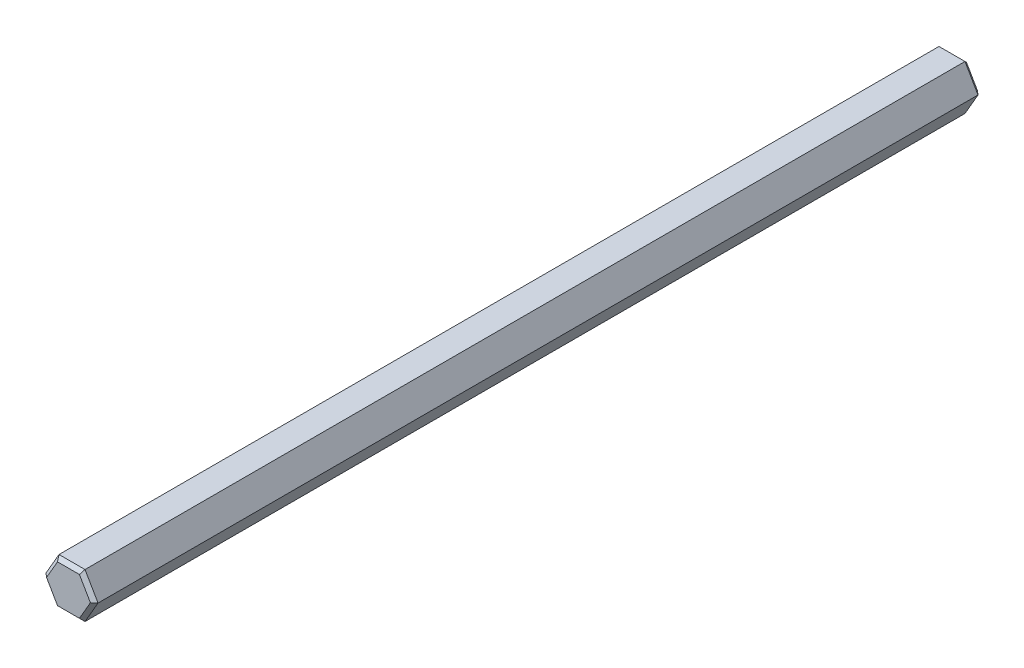
ISO-10303-21;
HEADER;
FILE_DESCRIPTION(('STEP AP214'),'2;1');
FILE_NAME('part.step','',(''),(''),'','','');
FILE_SCHEMA(('AUTOMOTIVE_DESIGN { 1 0 10303 214 1 1 1 1 }'));
ENDSEC;
DATA;
#1=APPLICATION_CONTEXT('core data for automotive mechanical design processes');
#2=APPLICATION_PROTOCOL_DEFINITION('international standard','automotive_design',2000,#1);
#3=PRODUCT_CONTEXT('',#1,'mechanical');
#4=PRODUCT('Part','Part','',(#3));
#5=PRODUCT_RELATED_PRODUCT_CATEGORY('part','',(#4));
#6=PRODUCT_DEFINITION_FORMATION('','',#4);
#7=PRODUCT_DEFINITION_CONTEXT('part definition',#1,'design');
#8=PRODUCT_DEFINITION('design','',#6,#7);
#9=PRODUCT_DEFINITION_SHAPE('','',#8);
#10=(LENGTH_UNIT() NAMED_UNIT(*) SI_UNIT(.MILLI.,.METRE.));
#11=(NAMED_UNIT(*) PLANE_ANGLE_UNIT() SI_UNIT($,.RADIAN.));
#12=(NAMED_UNIT(*) SI_UNIT($,.STERADIAN.) SOLID_ANGLE_UNIT());
#13=UNCERTAINTY_MEASURE_WITH_UNIT(LENGTH_MEASURE(1.E-05),#10,'distance_accuracy_value','');
#14=(GEOMETRIC_REPRESENTATION_CONTEXT(3) GLOBAL_UNCERTAINTY_ASSIGNED_CONTEXT((#13)) GLOBAL_UNIT_ASSIGNED_CONTEXT((#10,
#11,#12)) REPRESENTATION_CONTEXT('',''));
#15=CARTESIAN_POINT('',(0.,0.,0.));
#16=DIRECTION('',(0.,0.,1.));
#17=DIRECTION('',(1.,0.,0.));
#18=AXIS2_PLACEMENT_3D('',#15,#16,#17);
#19=CARTESIAN_POINT('',(1.8330871046771,-3.17499999999998,62.5));
#20=DIRECTION('',(-0.866025403784441,0.499999999999995,0.));
#21=DIRECTION('',(-0.499999999999995,-0.866025403784441,0.));
#22=AXIS2_PLACEMENT_3D('',#19,#20,#21);
#23=PLANE('',#22);
#24=DIRECTION('',(0.,0.,-1.));
#25=VECTOR('',#24,1.);
#26=CARTESIAN_POINT('',(1.8330871046771,-3.17499999999998,62.5));
#27=LINE('',#26,#25);
#28=CARTESIAN_POINT('',(1.8330871046771,-3.17499999999998,62.));
#29=VERTEX_POINT('',#28);
#30=CARTESIAN_POINT('',(1.8330871046771,-3.17499999999998,-62.));
#31=VERTEX_POINT('',#30);
#32=EDGE_CURVE('E222',#29,#31,#27,.T.);
#33=ORIENTED_EDGE('',*,*,#32,.T.);
#34=DIRECTION('',(0.499999999999995,0.866025403784441,0.));
#35=VECTOR('',#34,1.);
#36=CARTESIAN_POINT('',(1.8330871046771,-3.17499999999998,-62.));
#37=LINE('',#36,#35);
#38=CARTESIAN_POINT('',(3.66617420935413,0.,-62.));
#39=VERTEX_POINT('',#38);
#40=EDGE_CURVE('E197',#31,#39,#37,.T.);
#41=ORIENTED_EDGE('',*,*,#40,.T.);
#42=DIRECTION('',(0.,0.,-1.));
#43=VECTOR('',#42,1.);
#44=CARTESIAN_POINT('',(3.66617420935413,0.,62.5));
#45=LINE('',#44,#43);
#46=CARTESIAN_POINT('',(3.66617420935413,0.,62.));
#47=VERTEX_POINT('',#46);
#48=EDGE_CURVE('E151',#47,#39,#45,.T.);
#49=ORIENTED_EDGE('',*,*,#48,.F.);
#50=DIRECTION('',(-0.499999999999995,-0.866025403784441,0.));
#51=VECTOR('',#50,1.);
#52=CARTESIAN_POINT('',(1.8330871046771,-3.17499999999998,62.));
#53=LINE('',#52,#51);
#54=EDGE_CURVE('E195',#47,#29,#53,.T.);
#55=ORIENTED_EDGE('',*,*,#54,.T.);
#56=EDGE_LOOP('',(#33,#41,#49,#55));
#57=FACE_BOUND('',#56,.T.);
#58=ADVANCED_FACE('F38',(#57),#23,.F.);
#59=CARTESIAN_POINT('',(3.66617420935413,0.,62.5));
#60=DIRECTION('',(-0.866025403784438,-0.500000000000001,0.));
#61=DIRECTION('',(0.500000000000001,-0.866025403784438,0.));
#62=AXIS2_PLACEMENT_3D('',#59,#60,#61);
#63=PLANE('',#62);
#64=ORIENTED_EDGE('',*,*,#48,.T.);
#65=DIRECTION('',(-0.500000000000001,0.866025403784438,0.));
#66=VECTOR('',#65,1.);
#67=CARTESIAN_POINT('',(3.66617420935413,0.,-62.));
#68=LINE('',#67,#66);
#69=CARTESIAN_POINT('',(1.83308710467706,3.17500000000001,-62.));
#70=VERTEX_POINT('',#69);
#71=EDGE_CURVE('E150',#39,#70,#68,.T.);
#72=ORIENTED_EDGE('',*,*,#71,.T.);
#73=DIRECTION('',(0.,0.,-1.));
#74=VECTOR('',#73,1.);
#75=CARTESIAN_POINT('',(1.83308710467706,3.17500000000001,62.5));
#76=LINE('',#75,#74);
#77=CARTESIAN_POINT('',(1.83308710467706,3.17500000000001,62.));
#78=VERTEX_POINT('',#77);
#79=EDGE_CURVE('E132',#78,#70,#76,.T.);
#80=ORIENTED_EDGE('',*,*,#79,.F.);
#81=DIRECTION('',(0.500000000000001,-0.866025403784438,0.));
#82=VECTOR('',#81,1.);
#83=CARTESIAN_POINT('',(3.66617420935413,0.,62.));
#84=LINE('',#83,#82);
#85=EDGE_CURVE('E147',#78,#47,#84,.T.);
#86=ORIENTED_EDGE('',*,*,#85,.T.);
#87=EDGE_LOOP('',(#64,#72,#80,#86));
#88=FACE_BOUND('',#87,.T.);
#89=ADVANCED_FACE('F145',(#88),#63,.F.);
#90=CARTESIAN_POINT('',(1.83308710467706,3.17500000000001,62.5));
#91=DIRECTION('',(0.,-1.,0.));
#92=DIRECTION('',(1.,0.,0.));
#93=AXIS2_PLACEMENT_3D('',#90,#91,#92);
#94=PLANE('',#93);
#95=ORIENTED_EDGE('',*,*,#79,.T.);
#96=DIRECTION('',(-1.,0.,0.));
#97=VECTOR('',#96,1.);
#98=CARTESIAN_POINT('',(1.83308710467706,3.17500000000001,-62.));
#99=LINE('',#98,#97);
#100=CARTESIAN_POINT('',(-1.83308710467708,3.17499999999999,-62.));
#101=VERTEX_POINT('',#100);
#102=EDGE_CURVE('E139',#70,#101,#99,.T.);
#103=ORIENTED_EDGE('',*,*,#102,.T.);
#104=DIRECTION('',(0.,0.,-1.));
#105=VECTOR('',#104,1.);
#106=CARTESIAN_POINT('',(-1.83308710467708,3.17499999999999,62.5));
#107=LINE('',#106,#105);
#108=CARTESIAN_POINT('',(-1.83308710467708,3.17499999999999,62.));
#109=VERTEX_POINT('',#108);
#110=EDGE_CURVE('E134',#109,#101,#107,.T.);
#111=ORIENTED_EDGE('',*,*,#110,.F.);
#112=DIRECTION('',(1.,0.,0.));
#113=VECTOR('',#112,1.);
#114=CARTESIAN_POINT('',(1.83308710467706,3.17500000000001,62.));
#115=LINE('',#114,#113);
#116=EDGE_CURVE('E129',#109,#78,#115,.T.);
#117=ORIENTED_EDGE('',*,*,#116,.T.);
#118=EDGE_LOOP('',(#95,#103,#111,#117));
#119=FACE_BOUND('',#118,.T.);
#120=ADVANCED_FACE('F131',(#119),#94,.F.);
#121=CARTESIAN_POINT('',(-1.83308710467708,3.17499999999999,62.5));
#122=DIRECTION('',(0.866025403784442,-0.499999999999995,0.));
#123=DIRECTION('',(0.499999999999995,0.866025403784442,0.));
#124=AXIS2_PLACEMENT_3D('',#121,#122,#123);
#125=PLANE('',#124);
#126=ORIENTED_EDGE('',*,*,#110,.T.);
#127=DIRECTION('',(-0.499999999999995,-0.866025403784442,0.));
#128=VECTOR('',#127,1.);
#129=CARTESIAN_POINT('',(-1.83308710467708,3.17499999999999,-62.));
#130=LINE('',#129,#128);
#131=CARTESIAN_POINT('',(-3.66617420935412,0.,-62.));
#132=VERTEX_POINT('',#131);
#133=EDGE_CURVE('E184',#101,#132,#130,.T.);
#134=ORIENTED_EDGE('',*,*,#133,.T.);
#135=DIRECTION('',(0.,0.,-1.));
#136=VECTOR('',#135,1.);
#137=CARTESIAN_POINT('',(-3.66617420935412,0.,62.5));
#138=LINE('',#137,#136);
#139=CARTESIAN_POINT('',(-3.66617420935412,0.,62.));
#140=VERTEX_POINT('',#139);
#141=EDGE_CURVE('E240',#140,#132,#138,.T.);
#142=ORIENTED_EDGE('',*,*,#141,.F.);
#143=DIRECTION('',(0.499999999999995,0.866025403784442,0.));
#144=VECTOR('',#143,1.);
#145=CARTESIAN_POINT('',(-1.83308710467708,3.17499999999999,62.));
#146=LINE('',#145,#144);
#147=EDGE_CURVE('E182',#140,#109,#146,.T.);
#148=ORIENTED_EDGE('',*,*,#147,.T.);
#149=EDGE_LOOP('',(#126,#134,#142,#148));
#150=FACE_BOUND('',#149,.T.);
#151=ADVANCED_FACE('F237',(#150),#125,.F.);
#152=CARTESIAN_POINT('',(-3.66617420935412,0.,62.5));
#153=DIRECTION('',(0.866025403784435,0.500000000000007,0.));
#154=DIRECTION('',(-0.500000000000007,0.866025403784435,0.));
#155=AXIS2_PLACEMENT_3D('',#152,#153,#154);
#156=PLANE('',#155);
#157=ORIENTED_EDGE('',*,*,#141,.T.);
#158=DIRECTION('',(0.500000000000007,-0.866025403784435,0.));
#159=VECTOR('',#158,1.);
#160=CARTESIAN_POINT('',(-3.66617420935412,0.,-62.));
#161=LINE('',#160,#159);
#162=CARTESIAN_POINT('',(-1.83308710467703,-3.17500000000002,-62.));
#163=VERTEX_POINT('',#162);
#164=EDGE_CURVE('E188',#132,#163,#161,.T.);
#165=ORIENTED_EDGE('',*,*,#164,.T.);
#166=DIRECTION('',(0.,0.,-1.));
#167=VECTOR('',#166,1.);
#168=CARTESIAN_POINT('',(-1.83308710467703,-3.17500000000002,62.5));
#169=LINE('',#168,#167);
#170=CARTESIAN_POINT('',(-1.83308710467703,-3.17500000000002,62.));
#171=VERTEX_POINT('',#170);
#172=EDGE_CURVE('E243',#171,#163,#169,.T.);
#173=ORIENTED_EDGE('',*,*,#172,.F.);
#174=DIRECTION('',(-0.500000000000007,0.866025403784435,0.));
#175=VECTOR('',#174,1.);
#176=CARTESIAN_POINT('',(-3.66617420935412,0.,62.));
#177=LINE('',#176,#175);
#178=EDGE_CURVE('E186',#171,#140,#177,.T.);
#179=ORIENTED_EDGE('',*,*,#178,.T.);
#180=EDGE_LOOP('',(#157,#165,#173,#179));
#181=FACE_BOUND('',#180,.T.);
#182=ADVANCED_FACE('F282',(#181),#156,.F.);
#183=CARTESIAN_POINT('',(-1.83308710467703,-3.17500000000002,62.5));
#184=DIRECTION('',(0.,1.,0.));
#185=DIRECTION('',(-1.,0.,0.));
#186=AXIS2_PLACEMENT_3D('',#183,#184,#185);
#187=PLANE('',#186);
#188=ORIENTED_EDGE('',*,*,#172,.T.);
#189=DIRECTION('',(1.,0.,0.));
#190=VECTOR('',#189,1.);
#191=CARTESIAN_POINT('',(-1.83308710467703,-3.17500000000002,-62.));
#192=LINE('',#191,#190);
#193=EDGE_CURVE('E193',#163,#31,#192,.T.);
#194=ORIENTED_EDGE('',*,*,#193,.T.);
#195=ORIENTED_EDGE('',*,*,#32,.F.);
#196=DIRECTION('',(-1.,0.,0.));
#197=VECTOR('',#196,1.);
#198=CARTESIAN_POINT('',(-1.83308710467703,-3.17500000000002,62.));
#199=LINE('',#198,#197);
#200=EDGE_CURVE('E190',#29,#171,#199,.T.);
#201=ORIENTED_EDGE('',*,*,#200,.T.);
#202=EDGE_LOOP('',(#188,#194,#195,#201));
#203=FACE_BOUND('',#202,.T.);
#204=ADVANCED_FACE('F283',(#203),#187,.F.);
#205=CARTESIAN_POINT('',(0.,0.,62.5));
#206=DIRECTION('',(0.,0.,1.));
#207=DIRECTION('',(1.,0.,0.));
#208=AXIS2_PLACEMENT_3D('',#205,#206,#207);
#209=PLANE('',#208);
#210=DIRECTION('',(0.500000000000007,-0.866025403784435,0.));
#211=VECTOR('',#210,1.);
#212=CARTESIAN_POINT('',(-1.40007440278482,-2.92500000000002,62.5));
#213=LINE('',#212,#211);
#214=CARTESIAN_POINT('',(-3.0888239401645,0.,62.5));
#215=VERTEX_POINT('',#214);
#216=CARTESIAN_POINT('',(-1.54441197008223,-2.67500000000002,62.5));
#217=VERTEX_POINT('',#216);
#218=EDGE_CURVE('E48',#215,#217,#213,.T.);
#219=ORIENTED_EDGE('',*,*,#218,.T.);
#220=DIRECTION('',(1.,0.,0.));
#221=VECTOR('',#220,1.);
#222=CARTESIAN_POINT('',(1.83308710467709,-2.67499999999998,62.5));
#223=LINE('',#222,#221);
#224=CARTESIAN_POINT('',(1.54441197008228,-2.67499999999998,62.5));
#225=VERTEX_POINT('',#224);
#226=EDGE_CURVE('E11',#217,#225,#223,.T.);
#227=ORIENTED_EDGE('',*,*,#226,.T.);
#228=DIRECTION('',(0.499999999999995,0.866025403784441,0.));
#229=VECTOR('',#228,1.);
#230=CARTESIAN_POINT('',(3.23316150746191,0.249999999999997,62.5));
#231=LINE('',#230,#229);
#232=CARTESIAN_POINT('',(3.0888239401645,0.,62.5));
#233=VERTEX_POINT('',#232);
#234=EDGE_CURVE('E199',#225,#233,#231,.T.);
#235=ORIENTED_EDGE('',*,*,#234,.T.);
#236=DIRECTION('',(-0.500000000000001,0.866025403784438,0.));
#237=VECTOR('',#236,1.);
#238=CARTESIAN_POINT('',(1.40007440278484,2.92500000000001,62.5));
#239=LINE('',#238,#237);
#240=CARTESIAN_POINT('',(1.54441197008224,2.67500000000001,62.5));
#241=VERTEX_POINT('',#240);
#242=EDGE_CURVE('E201',#233,#241,#239,.T.);
#243=ORIENTED_EDGE('',*,*,#242,.T.);
#244=DIRECTION('',(-1.,0.,0.));
#245=VECTOR('',#244,1.);
#246=CARTESIAN_POINT('',(-1.83308710467708,2.67499999999999,62.5));
#247=LINE('',#246,#245);
#248=CARTESIAN_POINT('',(-1.54441197008226,2.675,62.5));
#249=VERTEX_POINT('',#248);
#250=EDGE_CURVE('E156',#241,#249,#247,.T.);
#251=ORIENTED_EDGE('',*,*,#250,.T.);
#252=DIRECTION('',(-0.499999999999995,-0.866025403784442,0.));
#253=VECTOR('',#252,1.);
#254=CARTESIAN_POINT('',(-3.23316150746191,-0.250000000000023,62.5));
#255=LINE('',#254,#253);
#256=EDGE_CURVE('E59',#249,#215,#255,.T.);
#257=ORIENTED_EDGE('',*,*,#256,.T.);
#258=EDGE_LOOP('',(#219,#227,#235,#243,#251,#257));
#259=FACE_BOUND('',#258,.T.);
#260=ADVANCED_FACE('F291',(#259),#209,.T.);
#261=CARTESIAN_POINT('',(0.,0.,-62.5));
#262=DIRECTION('',(0.,0.,1.));
#263=DIRECTION('',(1.,0.,0.));
#264=AXIS2_PLACEMENT_3D('',#261,#262,#263);
#265=PLANE('',#264);
#266=DIRECTION('',(1.,0.,0.));
#267=VECTOR('',#266,1.);
#268=CARTESIAN_POINT('',(0.,2.67499999999998,-62.5));
#269=LINE('',#268,#267);
#270=CARTESIAN_POINT('',(-1.54441197008225,2.67499999999998,-62.5));
#271=VERTEX_POINT('',#270);
#272=CARTESIAN_POINT('',(1.54441197008223,2.67499999999999,-62.5));
#273=VERTEX_POINT('',#272);
#274=EDGE_CURVE('E177',#271,#273,#269,.T.);
#275=ORIENTED_EDGE('',*,*,#274,.T.);
#276=DIRECTION('',(0.500000000000001,-0.866025403784438,0.));
#277=VECTOR('',#276,1.);
#278=CARTESIAN_POINT('',(2.31661795512336,1.33749999999999,-62.5));
#279=LINE('',#278,#277);
#280=CARTESIAN_POINT('',(3.08882394016448,0.,-62.5));
#281=VERTEX_POINT('',#280);
#282=EDGE_CURVE('E140',#273,#281,#279,.T.);
#283=ORIENTED_EDGE('',*,*,#282,.T.);
#284=DIRECTION('',(-0.499999999999995,-0.866025403784441,0.));
#285=VECTOR('',#284,1.);
#286=CARTESIAN_POINT('',(2.31661795512338,-1.33749999999998,-62.5));
#287=LINE('',#286,#285);
#288=CARTESIAN_POINT('',(1.54441197008227,-2.67499999999997,-62.5));
#289=VERTEX_POINT('',#288);
#290=EDGE_CURVE('E166',#281,#289,#287,.T.);
#291=ORIENTED_EDGE('',*,*,#290,.T.);
#292=DIRECTION('',(-1.,0.,0.));
#293=VECTOR('',#292,1.);
#294=CARTESIAN_POINT('',(0.,-2.67499999999998,-62.5));
#295=LINE('',#294,#293);
#296=CARTESIAN_POINT('',(-1.54441197008221,-2.675,-62.5));
#297=VERTEX_POINT('',#296);
#298=EDGE_CURVE('E171',#289,#297,#295,.T.);
#299=ORIENTED_EDGE('',*,*,#298,.T.);
#300=DIRECTION('',(-0.500000000000007,0.866025403784435,0.));
#301=VECTOR('',#300,1.);
#302=CARTESIAN_POINT('',(-2.31661795512335,-1.33750000000001,-62.5));
#303=LINE('',#302,#301);
#304=CARTESIAN_POINT('',(-3.08882394016448,0.,-62.5));
#305=VERTEX_POINT('',#304);
#306=EDGE_CURVE('E173',#297,#305,#303,.T.);
#307=ORIENTED_EDGE('',*,*,#306,.T.);
#308=DIRECTION('',(0.499999999999995,0.866025403784442,0.));
#309=VECTOR('',#308,1.);
#310=CARTESIAN_POINT('',(-2.31661795512337,1.33749999999998,-62.5));
#311=LINE('',#310,#309);
#312=EDGE_CURVE('E175',#305,#271,#311,.T.);
#313=ORIENTED_EDGE('',*,*,#312,.T.);
#314=EDGE_LOOP('',(#275,#283,#291,#299,#307,#313));
#315=FACE_BOUND('',#314,.T.);
#316=ADVANCED_FACE('F293',(#315),#265,.F.);
#317=CARTESIAN_POINT('',(-3.66617420935412,0.,-62.));
#318=DIRECTION('',(0.612372435695799,0.353553390593283,0.707106781186539));
#319=DIRECTION('',(0.500000000000007,-0.866025403784435,0.));
#320=AXIS2_PLACEMENT_3D('',#317,#318,#319);
#321=PLANE('',#320);
#322=DIRECTION('',(0.755928946018447,0.,-0.654653670707986));
#323=VECTOR('',#322,1.);
#324=CARTESIAN_POINT('',(-3.66617420935412,0.,-62.));
#325=LINE('',#324,#323);
#326=EDGE_CURVE('E216',#305,#132,#325,.F.);
#327=ORIENTED_EDGE('',*,*,#326,.F.);
#328=ORIENTED_EDGE('',*,*,#306,.F.);
#329=DIRECTION('',(0.377964473009217,0.654653670707975,-0.654653670707985));
#330=VECTOR('',#329,1.);
#331=CARTESIAN_POINT('',(-1.83308710467703,-3.17500000000002,-62.));
#332=LINE('',#331,#330);
#333=EDGE_CURVE('E219',#163,#297,#332,.T.);
#334=ORIENTED_EDGE('',*,*,#333,.F.);
#335=ORIENTED_EDGE('',*,*,#164,.F.);
#336=EDGE_LOOP('',(#327,#328,#334,#335));
#337=FACE_BOUND('',#336,.T.);
#338=ADVANCED_FACE('F279',(#337),#321,.F.);
#339=CARTESIAN_POINT('',(-1.83308710467703,-3.17500000000002,-62.));
#340=DIRECTION('',(0.,0.707106781186555,0.70710678118654));
#341=DIRECTION('',(1.,0.,0.));
#342=AXIS2_PLACEMENT_3D('',#339,#340,#341);
#343=PLANE('',#342);
#344=ORIENTED_EDGE('',*,*,#333,.T.);
#345=ORIENTED_EDGE('',*,*,#298,.F.);
#346=DIRECTION('',(-0.377964473009229,0.654653670707967,-0.654653670707986));
#347=VECTOR('',#346,1.);
#348=CARTESIAN_POINT('',(1.8330871046771,-3.17499999999998,-62.));
#349=LINE('',#348,#347);
#350=EDGE_CURVE('E213',#31,#289,#349,.T.);
#351=ORIENTED_EDGE('',*,*,#350,.F.);
#352=ORIENTED_EDGE('',*,*,#193,.F.);
#353=EDGE_LOOP('',(#344,#345,#351,#352));
#354=FACE_BOUND('',#353,.T.);
#355=ADVANCED_FACE('F259',(#354),#343,.F.);
#356=CARTESIAN_POINT('',(-1.83308710467708,3.17499999999999,-62.));
#357=DIRECTION('',(0.612372435695804,-0.353553390593274,0.707106781186539));
#358=DIRECTION('',(-0.499999999999995,-0.866025403784442,0.));
#359=AXIS2_PLACEMENT_3D('',#356,#357,#358);
#360=PLANE('',#359);
#361=ORIENTED_EDGE('',*,*,#326,.T.);
#362=ORIENTED_EDGE('',*,*,#133,.F.);
#363=DIRECTION('',(0.377964473009226,-0.65465367070797,-0.654653670707985));
#364=VECTOR('',#363,1.);
#365=CARTESIAN_POINT('',(-1.83308710467708,3.17499999999999,-62.));
#366=LINE('',#365,#364);
#367=EDGE_CURVE('E210',#271,#101,#366,.F.);
#368=ORIENTED_EDGE('',*,*,#367,.F.);
#369=ORIENTED_EDGE('',*,*,#312,.F.);
#370=EDGE_LOOP('',(#361,#362,#368,#369));
#371=FACE_BOUND('',#370,.T.);
#372=ADVANCED_FACE('F275',(#371),#360,.F.);
#373=CARTESIAN_POINT('',(1.8330871046771,-3.17499999999998,-62.));
#374=DIRECTION('',(-0.612372435695803,0.353553390593274,0.70710678118654));
#375=DIRECTION('',(0.499999999999995,0.866025403784441,0.));
#376=AXIS2_PLACEMENT_3D('',#373,#374,#375);
#377=PLANE('',#376);
#378=ORIENTED_EDGE('',*,*,#350,.T.);
#379=ORIENTED_EDGE('',*,*,#290,.F.);
#380=DIRECTION('',(0.755928946018447,0.,0.654653670707986));
#381=VECTOR('',#380,1.);
#382=CARTESIAN_POINT('',(2.61869586382441,0.,-62.9071428571428));
#383=LINE('',#382,#381);
#384=EDGE_CURVE('E208',#39,#281,#383,.F.);
#385=ORIENTED_EDGE('',*,*,#384,.F.);
#386=ORIENTED_EDGE('',*,*,#40,.F.);
#387=EDGE_LOOP('',(#378,#379,#385,#386));
#388=FACE_BOUND('',#387,.T.);
#389=ADVANCED_FACE('F263',(#388),#377,.F.);
#390=CARTESIAN_POINT('',(1.83308710467706,3.17500000000001,-62.));
#391=DIRECTION('',(0.,-0.707106781186555,0.70710678118654));
#392=DIRECTION('',(-1.,0.,0.));
#393=AXIS2_PLACEMENT_3D('',#390,#391,#392);
#394=PLANE('',#393);
#395=ORIENTED_EDGE('',*,*,#367,.T.);
#396=ORIENTED_EDGE('',*,*,#102,.F.);
#397=DIRECTION('',(-0.377964473009222,-0.654653670707972,-0.654653670707985));
#398=VECTOR('',#397,1.);
#399=CARTESIAN_POINT('',(1.83308710467706,3.17500000000001,-62.));
#400=LINE('',#399,#398);
#401=EDGE_CURVE('E206',#273,#70,#400,.F.);
#402=ORIENTED_EDGE('',*,*,#401,.F.);
#403=ORIENTED_EDGE('',*,*,#274,.F.);
#404=EDGE_LOOP('',(#395,#396,#402,#403));
#405=FACE_BOUND('',#404,.T.);
#406=ADVANCED_FACE('F271',(#405),#394,.F.);
#407=CARTESIAN_POINT('',(3.66617420935413,0.,-62.));
#408=DIRECTION('',(-0.612372435695801,-0.353553390593279,0.70710678118654));
#409=DIRECTION('',(-0.500000000000001,0.866025403784438,0.));
#410=AXIS2_PLACEMENT_3D('',#407,#408,#409);
#411=PLANE('',#410);
#412=ORIENTED_EDGE('',*,*,#384,.T.);
#413=ORIENTED_EDGE('',*,*,#282,.F.);
#414=ORIENTED_EDGE('',*,*,#401,.T.);
#415=ORIENTED_EDGE('',*,*,#71,.F.);
#416=EDGE_LOOP('',(#412,#413,#414,#415));
#417=FACE_BOUND('',#416,.T.);
#418=ADVANCED_FACE('F266',(#417),#411,.F.);
#419=CARTESIAN_POINT('',(0.,2.675,62.5));
#420=DIRECTION('',(0.,0.707106781186549,0.707106781186546));
#421=DIRECTION('',(1.,0.,0.));
#422=AXIS2_PLACEMENT_3D('',#419,#420,#421);
#423=PLANE('',#422);
#424=DIRECTION('',(-0.377964473009225,-0.654653670707977,0.654653670707978));
#425=VECTOR('',#424,1.);
#426=CARTESIAN_POINT('',(1.32378168864192,2.29285714285715,62.8821428571429));
#427=LINE('',#426,#425);
#428=EDGE_CURVE('E155',#78,#241,#427,.T.);
#429=ORIENTED_EDGE('',*,*,#428,.F.);
#430=ORIENTED_EDGE('',*,*,#116,.F.);
#431=DIRECTION('',(0.37796447300923,-0.654653670707974,0.654653670707978));
#432=VECTOR('',#431,1.);
#433=CARTESIAN_POINT('',(-1.32378168864194,2.29285714285714,62.8821428571429));
#434=LINE('',#433,#432);
#435=EDGE_CURVE('E43',#249,#109,#434,.F.);
#436=ORIENTED_EDGE('',*,*,#435,.F.);
#437=ORIENTED_EDGE('',*,*,#250,.F.);
#438=EDGE_LOOP('',(#429,#430,#436,#437));
#439=FACE_BOUND('',#438,.T.);
#440=ADVANCED_FACE('F41',(#439),#423,.T.);
#441=CARTESIAN_POINT('',(-2.31661795512338,1.33749999999999,62.5));
#442=DIRECTION('',(-0.612372435695797,0.353553390593271,0.707106781186546));
#443=DIRECTION('',(0.499999999999995,0.866025403784442,0.));
#444=AXIS2_PLACEMENT_3D('',#441,#442,#443);
#445=PLANE('',#444);
#446=ORIENTED_EDGE('',*,*,#435,.T.);
#447=ORIENTED_EDGE('',*,*,#147,.F.);
#448=DIRECTION('',(0.755928946018454,0.,0.654653670707978));
#449=VECTOR('',#448,1.);
#450=CARTESIAN_POINT('',(-2.64756337728386,0.,62.8821428571429));
#451=LINE('',#450,#449);
#452=EDGE_CURVE('E159',#215,#140,#451,.F.);
#453=ORIENTED_EDGE('',*,*,#452,.F.);
#454=ORIENTED_EDGE('',*,*,#256,.F.);
#455=EDGE_LOOP('',(#446,#447,#453,#454));
#456=FACE_BOUND('',#455,.T.);
#457=ADVANCED_FACE('F234',(#456),#445,.T.);
#458=CARTESIAN_POINT('',(2.31661795512337,1.3375,62.5));
#459=DIRECTION('',(0.612372435695795,0.353553390593275,0.707106781186546));
#460=DIRECTION('',(0.500000000000001,-0.866025403784438,0.));
#461=AXIS2_PLACEMENT_3D('',#458,#459,#460);
#462=PLANE('',#461);
#463=ORIENTED_EDGE('',*,*,#428,.T.);
#464=ORIENTED_EDGE('',*,*,#242,.F.);
#465=DIRECTION('',(-0.755928946018453,0.,0.654653670707979));
#466=VECTOR('',#465,1.);
#467=CARTESIAN_POINT('',(2.64756337728387,0.,62.8821428571429));
#468=LINE('',#467,#466);
#469=EDGE_CURVE('E163',#47,#233,#468,.T.);
#470=ORIENTED_EDGE('',*,*,#469,.F.);
#471=ORIENTED_EDGE('',*,*,#85,.F.);
#472=EDGE_LOOP('',(#463,#464,#470,#471));
#473=FACE_BOUND('',#472,.T.);
#474=ADVANCED_FACE('F161',(#473),#462,.T.);
#475=CARTESIAN_POINT('',(-2.31661795512336,-1.33750000000002,62.5));
#476=DIRECTION('',(-0.612372435695793,-0.353553390593279,0.707106781186546));
#477=DIRECTION('',(-0.500000000000007,0.866025403784435,0.));
#478=AXIS2_PLACEMENT_3D('',#475,#476,#477);
#479=PLANE('',#478);
#480=ORIENTED_EDGE('',*,*,#452,.T.);
#481=ORIENTED_EDGE('',*,*,#178,.F.);
#482=DIRECTION('',(0.377964473009221,0.65465367070798,0.654653670707978));
#483=VECTOR('',#482,1.);
#484=CARTESIAN_POINT('',(-1.32378168864191,-2.29285714285716,62.8821428571429));
#485=LINE('',#484,#483);
#486=EDGE_CURVE('E225',#217,#171,#485,.F.);
#487=ORIENTED_EDGE('',*,*,#486,.F.);
#488=ORIENTED_EDGE('',*,*,#218,.F.);
#489=EDGE_LOOP('',(#480,#481,#487,#488));
#490=FACE_BOUND('',#489,.T.);
#491=ADVANCED_FACE('F231',(#490),#479,.T.);
#492=CARTESIAN_POINT('',(2.31661795512339,-1.33749999999999,62.5));
#493=DIRECTION('',(0.612372435695798,-0.353553390593271,0.707106781186546));
#494=DIRECTION('',(-0.499999999999995,-0.866025403784441,0.));
#495=AXIS2_PLACEMENT_3D('',#492,#493,#494);
#496=PLANE('',#495);
#497=ORIENTED_EDGE('',*,*,#469,.T.);
#498=ORIENTED_EDGE('',*,*,#234,.F.);
#499=DIRECTION('',(0.377964473009232,-0.654653670707973,-0.654653670707979));
#500=VECTOR('',#499,1.);
#501=CARTESIAN_POINT('',(1.32378168864196,-2.29285714285714,62.8821428571429));
#502=LINE('',#501,#500);
#503=EDGE_CURVE('E223',#29,#225,#502,.F.);
#504=ORIENTED_EDGE('',*,*,#503,.F.);
#505=ORIENTED_EDGE('',*,*,#54,.F.);
#506=EDGE_LOOP('',(#497,#498,#504,#505));
#507=FACE_BOUND('',#506,.T.);
#508=ADVANCED_FACE('F290',(#507),#496,.T.);
#509=CARTESIAN_POINT('',(0.,-2.675,62.5));
#510=DIRECTION('',(0.,-0.707106781186549,0.707106781186546));
#511=DIRECTION('',(-1.,0.,0.));
#512=AXIS2_PLACEMENT_3D('',#509,#510,#511);
#513=PLANE('',#512);
#514=ORIENTED_EDGE('',*,*,#486,.T.);
#515=ORIENTED_EDGE('',*,*,#200,.F.);
#516=ORIENTED_EDGE('',*,*,#503,.T.);
#517=ORIENTED_EDGE('',*,*,#226,.F.);
#518=EDGE_LOOP('',(#514,#515,#516,#517));
#519=FACE_BOUND('',#518,.T.);
#520=ADVANCED_FACE('F286',(#519),#513,.T.);
#521=CLOSED_SHELL('',(#58,#89,#120,#151,#182,#204,#260,#316,#338,#355,#372,#389,#406,#418,#440,
#457,#474,#491,#508,#520));
#522=MANIFOLD_SOLID_BREP('B2',#521);
#523=ADVANCED_BREP_SHAPE_REPRESENTATION('',(#18,#522),#14);
#524=SHAPE_DEFINITION_REPRESENTATION(#9,#523);
ENDSEC;
END-ISO-10303-21;
